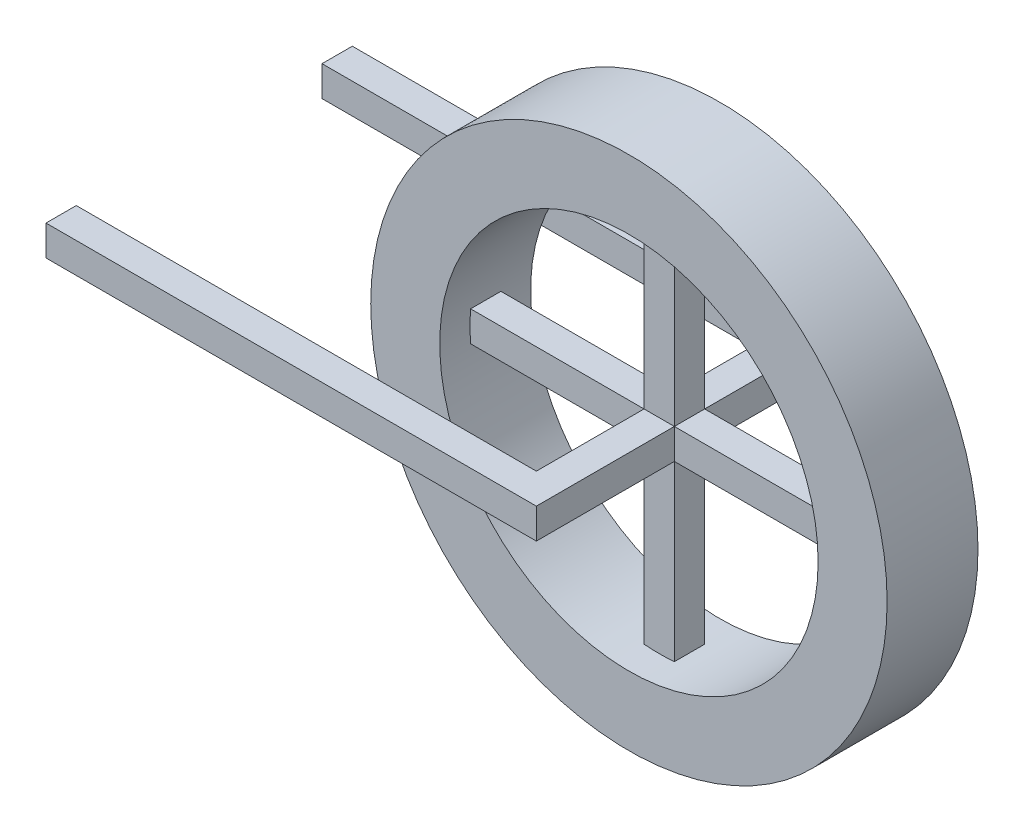
ISO-10303-21;
HEADER;
FILE_DESCRIPTION(('STEP AP214'),'2;1');
FILE_NAME('part.step','',(''),(''),'','','');
FILE_SCHEMA(('AUTOMOTIVE_DESIGN { 1 0 10303 214 1 1 1 1 }'));
ENDSEC;
DATA;
#1=APPLICATION_CONTEXT('core data for automotive mechanical design processes');
#2=APPLICATION_PROTOCOL_DEFINITION('international standard','automotive_design',2000,#1);
#3=PRODUCT_CONTEXT('',#1,'mechanical');
#4=PRODUCT('Part','Part','',(#3));
#5=PRODUCT_RELATED_PRODUCT_CATEGORY('part','',(#4));
#6=PRODUCT_DEFINITION_FORMATION('','',#4);
#7=PRODUCT_DEFINITION_CONTEXT('part definition',#1,'design');
#8=PRODUCT_DEFINITION('design','',#6,#7);
#9=PRODUCT_DEFINITION_SHAPE('','',#8);
#10=(LENGTH_UNIT() NAMED_UNIT(*) SI_UNIT(.MILLI.,.METRE.));
#11=(NAMED_UNIT(*) PLANE_ANGLE_UNIT() SI_UNIT($,.RADIAN.));
#12=(NAMED_UNIT(*) SI_UNIT($,.STERADIAN.) SOLID_ANGLE_UNIT());
#13=UNCERTAINTY_MEASURE_WITH_UNIT(LENGTH_MEASURE(1.E-05),#10,'distance_accuracy_value','');
#14=(GEOMETRIC_REPRESENTATION_CONTEXT(3) GLOBAL_UNCERTAINTY_ASSIGNED_CONTEXT((#13)) GLOBAL_UNIT_ASSIGNED_CONTEXT((#10,
#11,#12)) REPRESENTATION_CONTEXT('',''));
#15=CARTESIAN_POINT('',(0.,0.,0.));
#16=DIRECTION('',(0.,0.,1.));
#17=DIRECTION('',(1.,0.,0.));
#18=AXIS2_PLACEMENT_3D('',#15,#16,#17);
#19=CARTESIAN_POINT('',(56.126,3.29166666666667,13.1666666666667));
#20=DIRECTION('',(0.,0.,-1.));
#21=DIRECTION('',(-1.,0.,0.));
#22=AXIS2_PLACEMENT_3D('',#19,#20,#21);
#23=PLANE('',#22);
#24=DIRECTION('',(-1.,0.,0.));
#25=VECTOR('',#24,1.);
#26=CARTESIAN_POINT('',(56.126,3.29166666666667,13.1666666666667));
#27=LINE('',#26,#25);
#28=CARTESIAN_POINT('',(40.9930549673424,3.29166666666667,13.1666666666667));
#29=VERTEX_POINT('',#28);
#30=CARTESIAN_POINT('',(3.29166666666668,3.29166666666667,13.1666666666667));
#31=VERTEX_POINT('',#30);
#32=EDGE_CURVE('E349',#29,#31,#27,.T.);
#33=ORIENTED_EDGE('',*,*,#32,.T.);
#34=DIRECTION('',(0.,-1.,0.));
#35=VECTOR('',#34,1.);
#36=CARTESIAN_POINT('',(3.29166666666668,3.29166666666667,13.1666666666667));
#37=LINE('',#36,#35);
#38=CARTESIAN_POINT('',(3.29166666666668,-3.29166666666667,13.1666666666667));
#39=VERTEX_POINT('',#38);
#40=EDGE_CURVE('E210',#31,#39,#37,.T.);
#41=ORIENTED_EDGE('',*,*,#40,.T.);
#42=DIRECTION('',(-1.,0.,0.));
#43=VECTOR('',#42,1.);
#44=CARTESIAN_POINT('',(56.126,-3.29166666666667,13.1666666666667));
#45=LINE('',#44,#43);
#46=CARTESIAN_POINT('',(40.9930549673424,-3.29166666666667,13.1666666666667));
#47=VERTEX_POINT('',#46);
#48=EDGE_CURVE('E360',#47,#39,#45,.T.);
#49=ORIENTED_EDGE('',*,*,#48,.F.);
#50=CARTESIAN_POINT('',(0.,0.,13.1666666666667));
#51=DIRECTION('',(0.,0.,-1.));
#52=DIRECTION('',(-1.,0.,0.));
#53=AXIS2_PLACEMENT_3D('',#50,#51,#52);
#54=CIRCLE('',#53,41.125);
#55=EDGE_CURVE('E346',#47,#29,#54,.F.);
#56=ORIENTED_EDGE('',*,*,#55,.T.);
#57=EDGE_LOOP('',(#33,#41,#49,#56));
#58=FACE_BOUND('',#57,.T.);
#59=ADVANCED_FACE('F39',(#58),#23,.F.);
#60=DIRECTION('',(0.,1.,0.));
#61=VECTOR('',#60,1.);
#62=CARTESIAN_POINT('',(-3.29166666666686,-56.1260000000002,13.1666666666667));
#63=LINE('',#62,#61);
#64=CARTESIAN_POINT('',(-3.29166666666668,3.29166666666667,13.1666666666667));
#65=VERTEX_POINT('',#64);
#66=CARTESIAN_POINT('',(-3.29166666666653,40.9930549673424,13.1666666666667));
#67=VERTEX_POINT('',#66);
#68=EDGE_CURVE('E310',#65,#67,#63,.T.);
#69=ORIENTED_EDGE('',*,*,#68,.F.);
#70=DIRECTION('',(1.,0.,0.));
#71=VECTOR('',#70,1.);
#72=CARTESIAN_POINT('',(3.29166666666668,3.29166666666667,13.1666666666667));
#73=LINE('',#72,#71);
#74=EDGE_CURVE('E217',#65,#31,#73,.T.);
#75=ORIENTED_EDGE('',*,*,#74,.T.);
#76=DIRECTION('',(0.,1.,0.));
#77=VECTOR('',#76,1.);
#78=CARTESIAN_POINT('',(3.29166666666647,-56.1260000000002,13.1666666666667));
#79=LINE('',#78,#77);
#80=CARTESIAN_POINT('',(3.29166666666681,40.9930549673424,13.1666666666667));
#81=VERTEX_POINT('',#80);
#82=EDGE_CURVE('E289',#31,#81,#79,.T.);
#83=ORIENTED_EDGE('',*,*,#82,.T.);
#84=CARTESIAN_POINT('',(0.,0.,13.1666666666667));
#85=DIRECTION('',(0.,0.,1.));
#86=DIRECTION('',(1.,0.,0.));
#87=AXIS2_PLACEMENT_3D('',#84,#85,#86);
#88=CIRCLE('',#87,41.125);
#89=EDGE_CURVE('E283',#67,#81,#88,.F.);
#90=ORIENTED_EDGE('',*,*,#89,.F.);
#91=EDGE_LOOP('',(#69,#75,#83,#90));
#92=FACE_BOUND('',#91,.T.);
#93=ADVANCED_FACE('F395',(#92),#23,.F.);
#94=CARTESIAN_POINT('',(-3.29166666666668,-3.29166666666667,13.1666666666667));
#95=VERTEX_POINT('',#94);
#96=CARTESIAN_POINT('',(-40.9930549673424,-3.29166666666667,13.1666666666667));
#97=VERTEX_POINT('',#96);
#98=EDGE_CURVE('E359',#95,#97,#45,.T.);
#99=ORIENTED_EDGE('',*,*,#98,.F.);
#100=DIRECTION('',(0.,1.,0.));
#101=VECTOR('',#100,1.);
#102=CARTESIAN_POINT('',(-3.29166666666668,3.29166666666667,13.1666666666667));
#103=LINE('',#102,#101);
#104=EDGE_CURVE('E220',#95,#65,#103,.T.);
#105=ORIENTED_EDGE('',*,*,#104,.T.);
#106=CARTESIAN_POINT('',(-40.9930549673424,3.29166666666667,13.1666666666667));
#107=VERTEX_POINT('',#106);
#108=EDGE_CURVE('E339',#65,#107,#27,.T.);
#109=ORIENTED_EDGE('',*,*,#108,.T.);
#110=CARTESIAN_POINT('',(0.,0.,13.1666666666667));
#111=DIRECTION('',(0.,0.,1.));
#112=DIRECTION('',(1.,0.,0.));
#113=AXIS2_PLACEMENT_3D('',#110,#111,#112);
#114=CIRCLE('',#113,41.125);
#115=EDGE_CURVE('E333',#97,#107,#114,.F.);
#116=ORIENTED_EDGE('',*,*,#115,.F.);
#117=EDGE_LOOP('',(#99,#105,#109,#116));
#118=FACE_BOUND('',#117,.T.);
#119=ADVANCED_FACE('F473',(#118),#23,.F.);
#120=CARTESIAN_POINT('',(-3.29166666666668,3.29166666666667,-23.4166666666667));
#121=DIRECTION('',(1.,0.,0.));
#122=DIRECTION('',(0.,0.,-1.));
#123=AXIS2_PLACEMENT_3D('',#120,#121,#122);
#124=PLANE('',#123);
#125=DIRECTION('',(0.,1.,0.));
#126=VECTOR('',#125,1.);
#127=CARTESIAN_POINT('',(-3.29166666666668,3.29166666666667,-16.8333333333333));
#128=LINE('',#127,#126);
#129=CARTESIAN_POINT('',(-3.29166666666668,-3.29166666666667,-16.8333333333333));
#130=VERTEX_POINT('',#129);
#131=CARTESIAN_POINT('',(-3.29166666666668,3.29166666666667,-16.8333333333333));
#132=VERTEX_POINT('',#131);
#133=EDGE_CURVE('E231',#130,#132,#128,.T.);
#134=ORIENTED_EDGE('',*,*,#133,.F.);
#135=DIRECTION('',(0.,0.,1.));
#136=VECTOR('',#135,1.);
#137=CARTESIAN_POINT('',(-3.29166666666668,-3.29166666666667,-23.4166666666667));
#138=LINE('',#137,#136);
#139=CARTESIAN_POINT('',(-3.29166666666668,-3.29166666666667,6.58333333333333));
#140=VERTEX_POINT('',#139);
#141=EDGE_CURVE('E272',#130,#140,#138,.T.);
#142=ORIENTED_EDGE('',*,*,#141,.T.);
#143=DIRECTION('',(0.,1.,0.));
#144=VECTOR('',#143,1.);
#145=CARTESIAN_POINT('',(-3.29166666666668,3.29166666666667,6.58333333333333));
#146=LINE('',#145,#144);
#147=CARTESIAN_POINT('',(-3.29166666666665,3.29166666666667,6.58333333333333));
#148=VERTEX_POINT('',#147);
#149=EDGE_CURVE('E263',#140,#148,#146,.T.);
#150=ORIENTED_EDGE('',*,*,#149,.T.);
#151=DIRECTION('',(0.,0.,1.));
#152=VECTOR('',#151,1.);
#153=CARTESIAN_POINT('',(-3.29166666666668,3.29166666666667,-23.4166666666667));
#154=LINE('',#153,#152);
#155=EDGE_CURVE('E270',#132,#148,#154,.T.);
#156=ORIENTED_EDGE('',*,*,#155,.F.);
#157=EDGE_LOOP('',(#134,#142,#150,#156));
#158=FACE_BOUND('',#157,.T.);
#159=ADVANCED_FACE('F438',(#158),#124,.F.);
#160=CARTESIAN_POINT('',(56.126,3.29166666666667,6.58333333333333));
#161=DIRECTION('',(0.,0.,1.));
#162=DIRECTION('',(1.,0.,0.));
#163=AXIS2_PLACEMENT_3D('',#160,#161,#162);
#164=PLANE('',#163);
#165=DIRECTION('',(0.,-1.,0.));
#166=VECTOR('',#165,1.);
#167=CARTESIAN_POINT('',(3.29166666666668,3.29166666666667,6.58333333333333));
#168=LINE('',#167,#166);
#169=CARTESIAN_POINT('',(3.29166666666668,3.29166666666667,6.58333333333333));
#170=VERTEX_POINT('',#169);
#171=CARTESIAN_POINT('',(3.2916666666668,-3.29166666666667,6.58333333333333));
#172=VERTEX_POINT('',#171);
#173=EDGE_CURVE('E248',#170,#172,#168,.T.);
#174=ORIENTED_EDGE('',*,*,#173,.F.);
#175=DIRECTION('',(-1.,0.,0.));
#176=VECTOR('',#175,1.);
#177=CARTESIAN_POINT('',(56.126,3.29166666666667,6.58333333333333));
#178=LINE('',#177,#176);
#179=CARTESIAN_POINT('',(40.9930549673424,3.29166666666667,6.58333333333333));
#180=VERTEX_POINT('',#179);
#181=EDGE_CURVE('E353',#180,#170,#178,.T.);
#182=ORIENTED_EDGE('',*,*,#181,.F.);
#183=CARTESIAN_POINT('',(0.,0.,6.58333333333333));
#184=DIRECTION('',(0.,0.,1.));
#185=DIRECTION('',(1.,0.,0.));
#186=AXIS2_PLACEMENT_3D('',#183,#184,#185);
#187=CIRCLE('',#186,41.125);
#188=CARTESIAN_POINT('',(40.9930549673424,-3.29166666666667,6.58333333333333));
#189=VERTEX_POINT('',#188);
#190=EDGE_CURVE('E340',#180,#189,#187,.F.);
#191=ORIENTED_EDGE('',*,*,#190,.T.);
#192=DIRECTION('',(-1.,0.,0.));
#193=VECTOR('',#192,1.);
#194=CARTESIAN_POINT('',(56.126,-3.29166666666667,6.58333333333333));
#195=LINE('',#194,#193);
#196=EDGE_CURVE('E356',#189,#172,#195,.T.);
#197=ORIENTED_EDGE('',*,*,#196,.T.);
#198=EDGE_LOOP('',(#174,#182,#191,#197));
#199=FACE_BOUND('',#198,.T.);
#200=ADVANCED_FACE('F412',(#199),#164,.F.);
#201=DIRECTION('',(-1.,0.,0.));
#202=VECTOR('',#201,1.);
#203=CARTESIAN_POINT('',(3.29166666666668,-3.29166666666667,6.58333333333333));
#204=LINE('',#203,#202);
#205=EDGE_CURVE('E260',#172,#140,#204,.T.);
#206=ORIENTED_EDGE('',*,*,#205,.F.);
#207=DIRECTION('',(0.,1.,0.));
#208=VECTOR('',#207,1.);
#209=CARTESIAN_POINT('',(3.29166666666647,-56.1260000000002,6.58333333333333));
#210=LINE('',#209,#208);
#211=CARTESIAN_POINT('',(3.29166666666652,-40.9930549673424,6.58333333333333));
#212=VERTEX_POINT('',#211);
#213=EDGE_CURVE('E303',#212,#172,#210,.T.);
#214=ORIENTED_EDGE('',*,*,#213,.F.);
#215=CARTESIAN_POINT('',(0.,0.,6.58333333333333));
#216=DIRECTION('',(0.,0.,1.));
#217=DIRECTION('',(1.,0.,0.));
#218=AXIS2_PLACEMENT_3D('',#215,#216,#217);
#219=CIRCLE('',#218,41.125);
#220=CARTESIAN_POINT('',(-3.29166666666681,-40.9930549673424,6.58333333333333));
#221=VERTEX_POINT('',#220);
#222=EDGE_CURVE('E290',#212,#221,#219,.F.);
#223=ORIENTED_EDGE('',*,*,#222,.T.);
#224=DIRECTION('',(0.,1.,0.));
#225=VECTOR('',#224,1.);
#226=CARTESIAN_POINT('',(-3.29166666666686,-56.1260000000002,6.58333333333333));
#227=LINE('',#226,#225);
#228=EDGE_CURVE('E307',#221,#140,#227,.T.);
#229=ORIENTED_EDGE('',*,*,#228,.T.);
#230=EDGE_LOOP('',(#206,#214,#223,#229));
#231=FACE_BOUND('',#230,.T.);
#232=ADVANCED_FACE('F454',(#231),#164,.F.);
#233=ORIENTED_EDGE('',*,*,#149,.F.);
#234=CARTESIAN_POINT('',(-40.9930549673424,-3.29166666666667,6.58333333333333));
#235=VERTEX_POINT('',#234);
#236=EDGE_CURVE('E355',#140,#235,#195,.T.);
#237=ORIENTED_EDGE('',*,*,#236,.T.);
#238=CARTESIAN_POINT('',(0.,0.,6.58333333333333));
#239=DIRECTION('',(0.,0.,-1.));
#240=DIRECTION('',(-1.,0.,0.));
#241=AXIS2_PLACEMENT_3D('',#238,#239,#240);
#242=CIRCLE('',#241,41.125);
#243=CARTESIAN_POINT('',(-40.9930549673424,3.29166666666667,6.58333333333333));
#244=VERTEX_POINT('',#243);
#245=EDGE_CURVE('E327',#244,#235,#242,.F.);
#246=ORIENTED_EDGE('',*,*,#245,.F.);
#247=EDGE_CURVE('E352',#148,#244,#178,.T.);
#248=ORIENTED_EDGE('',*,*,#247,.F.);
#249=EDGE_LOOP('',(#233,#237,#246,#248));
#250=FACE_BOUND('',#249,.T.);
#251=ADVANCED_FACE('F444',(#250),#164,.F.);
#252=DIRECTION('',(1.,0.,0.));
#253=VECTOR('',#252,1.);
#254=CARTESIAN_POINT('',(3.29166666666668,3.29166666666667,6.58333333333333));
#255=LINE('',#254,#253);
#256=EDGE_CURVE('E253',#148,#170,#255,.T.);
#257=ORIENTED_EDGE('',*,*,#256,.F.);
#258=CARTESIAN_POINT('',(-3.29166666666652,40.9930549673424,6.58333333333333));
#259=VERTEX_POINT('',#258);
#260=EDGE_CURVE('E306',#148,#259,#227,.T.);
#261=ORIENTED_EDGE('',*,*,#260,.T.);
#262=CARTESIAN_POINT('',(0.,0.,6.58333333333333));
#263=DIRECTION('',(0.,0.,-1.));
#264=DIRECTION('',(-1.,0.,0.));
#265=AXIS2_PLACEMENT_3D('',#262,#263,#264);
#266=CIRCLE('',#265,41.125);
#267=CARTESIAN_POINT('',(3.29166666666681,40.9930549673424,6.58333333333333));
#268=VERTEX_POINT('',#267);
#269=EDGE_CURVE('E277',#268,#259,#266,.F.);
#270=ORIENTED_EDGE('',*,*,#269,.F.);
#271=EDGE_CURVE('E302',#170,#268,#210,.T.);
#272=ORIENTED_EDGE('',*,*,#271,.F.);
#273=EDGE_LOOP('',(#257,#261,#270,#272));
#274=FACE_BOUND('',#273,.T.);
#275=ADVANCED_FACE('F377',(#274),#164,.F.);
#276=CARTESIAN_POINT('',(0.,0.,19.75));
#277=DIRECTION('',(0.,0.,-1.));
#278=DIRECTION('',(-1.,0.,0.));
#279=AXIS2_PLACEMENT_3D('',#276,#277,#278);
#280=CYLINDRICAL_SURFACE('',#279,41.125);
#281=CARTESIAN_POINT('',(0.,0.,19.75));
#282=DIRECTION('',(0.,0.,1.));
#283=DIRECTION('',(1.,0.,0.));
#284=AXIS2_PLACEMENT_3D('',#281,#282,#283);
#285=CIRCLE('',#284,41.125);
#286=CARTESIAN_POINT('',(41.125,0.,19.75));
#287=VERTEX_POINT('',#286);
#288=EDGE_CURVE('E365',#287,#287,#285,.T.);
#289=ORIENTED_EDGE('',*,*,#288,.T.);
#290=EDGE_LOOP('',(#289));
#291=FACE_BOUND('',#290,.T.);
#292=CARTESIAN_POINT('',(0.,0.,0.));
#293=DIRECTION('',(0.,0.,1.));
#294=DIRECTION('',(1.,0.,0.));
#295=AXIS2_PLACEMENT_3D('',#292,#293,#294);
#296=CIRCLE('',#295,41.125);
#297=CARTESIAN_POINT('',(41.125,0.,0.));
#298=VERTEX_POINT('',#297);
#299=EDGE_CURVE('E348',#298,#298,#296,.T.);
#300=ORIENTED_EDGE('',*,*,#299,.F.);
#301=EDGE_LOOP('',(#300));
#302=FACE_BOUND('',#301,.T.);
#303=ORIENTED_EDGE('',*,*,#115,.T.);
#304=DIRECTION('',(0.,0.,-1.));
#305=VECTOR('',#304,1.);
#306=CARTESIAN_POINT('',(-40.9930549673424,3.29166666666667,19.75));
#307=LINE('',#306,#305);
#308=EDGE_CURVE('E330',#107,#244,#307,.T.);
#309=ORIENTED_EDGE('',*,*,#308,.T.);
#310=ORIENTED_EDGE('',*,*,#245,.T.);
#311=DIRECTION('',(0.,0.,-1.));
#312=VECTOR('',#311,1.);
#313=CARTESIAN_POINT('',(-40.9930549673424,-3.29166666666667,19.75));
#314=LINE('',#313,#312);
#315=EDGE_CURVE('E336',#235,#97,#314,.F.);
#316=ORIENTED_EDGE('',*,*,#315,.T.);
#317=EDGE_LOOP('',(#303,#309,#310,#316));
#318=FACE_BOUND('',#317,.T.);
#319=ORIENTED_EDGE('',*,*,#190,.F.);
#320=DIRECTION('',(0.,0.,-1.));
#321=VECTOR('',#320,1.);
#322=CARTESIAN_POINT('',(40.9930549673424,3.29166666666667,19.75));
#323=LINE('',#322,#321);
#324=EDGE_CURVE('E344',#29,#180,#323,.T.);
#325=ORIENTED_EDGE('',*,*,#324,.F.);
#326=ORIENTED_EDGE('',*,*,#55,.F.);
#327=DIRECTION('',(0.,0.,-1.));
#328=VECTOR('',#327,1.);
#329=CARTESIAN_POINT('',(40.9930549673424,-3.29166666666667,19.75));
#330=LINE('',#329,#328);
#331=EDGE_CURVE('E343',#189,#47,#330,.F.);
#332=ORIENTED_EDGE('',*,*,#331,.F.);
#333=EDGE_LOOP('',(#319,#325,#326,#332));
#334=FACE_BOUND('',#333,.T.);
#335=ORIENTED_EDGE('',*,*,#222,.F.);
#336=DIRECTION('',(0.,0.,-1.));
#337=VECTOR('',#336,1.);
#338=CARTESIAN_POINT('',(3.29166666666652,-40.9930549673424,19.75));
#339=LINE('',#338,#337);
#340=CARTESIAN_POINT('',(3.29166666666652,-40.9930549673424,13.1666666666667));
#341=VERTEX_POINT('',#340);
#342=EDGE_CURVE('E294',#341,#212,#339,.T.);
#343=ORIENTED_EDGE('',*,*,#342,.F.);
#344=CARTESIAN_POINT('',(0.,0.,13.1666666666667));
#345=DIRECTION('',(0.,0.,-1.));
#346=DIRECTION('',(-1.,0.,0.));
#347=AXIS2_PLACEMENT_3D('',#344,#345,#346);
#348=CIRCLE('',#347,41.125);
#349=CARTESIAN_POINT('',(-3.29166666666681,-40.9930549673424,13.1666666666667));
#350=VERTEX_POINT('',#349);
#351=EDGE_CURVE('E296',#350,#341,#348,.F.);
#352=ORIENTED_EDGE('',*,*,#351,.F.);
#353=DIRECTION('',(0.,0.,-1.));
#354=VECTOR('',#353,1.);
#355=CARTESIAN_POINT('',(-3.29166666666681,-40.9930549673424,19.75));
#356=LINE('',#355,#354);
#357=EDGE_CURVE('E293',#221,#350,#356,.F.);
#358=ORIENTED_EDGE('',*,*,#357,.F.);
#359=EDGE_LOOP('',(#335,#343,#352,#358));
#360=FACE_BOUND('',#359,.T.);
#361=ORIENTED_EDGE('',*,*,#89,.T.);
#362=DIRECTION('',(0.,0.,-1.));
#363=VECTOR('',#362,1.);
#364=CARTESIAN_POINT('',(3.29166666666681,40.9930549673424,19.75));
#365=LINE('',#364,#363);
#366=EDGE_CURVE('E280',#81,#268,#365,.T.);
#367=ORIENTED_EDGE('',*,*,#366,.T.);
#368=ORIENTED_EDGE('',*,*,#269,.T.);
#369=DIRECTION('',(0.,0.,-1.));
#370=VECTOR('',#369,1.);
#371=CARTESIAN_POINT('',(-3.29166666666653,40.9930549673424,19.75));
#372=LINE('',#371,#370);
#373=EDGE_CURVE('E286',#259,#67,#372,.F.);
#374=ORIENTED_EDGE('',*,*,#373,.T.);
#375=EDGE_LOOP('',(#361,#367,#368,#374));
#376=FACE_BOUND('',#375,.T.);
#377=ADVANCED_FACE('F373',(#291,#302,#318,#334,#360,#376),#280,.F.);
#378=CARTESIAN_POINT('',(56.126,3.29166666666667,13.1666666666667));
#379=DIRECTION('',(0.,-1.,0.));
#380=DIRECTION('',(0.,0.,-1.));
#381=AXIS2_PLACEMENT_3D('',#378,#379,#380);
#382=PLANE('',#381);
#383=DIRECTION('',(0.,0.,-1.));
#384=VECTOR('',#383,1.);
#385=CARTESIAN_POINT('',(3.29166666666668,3.29166666666667,13.1666666666667));
#386=LINE('',#385,#384);
#387=EDGE_CURVE('E324',#31,#170,#386,.T.);
#388=ORIENTED_EDGE('',*,*,#387,.F.);
#389=ORIENTED_EDGE('',*,*,#32,.F.);
#390=ORIENTED_EDGE('',*,*,#324,.T.);
#391=ORIENTED_EDGE('',*,*,#181,.T.);
#392=EDGE_LOOP('',(#388,#389,#390,#391));
#393=FACE_BOUND('',#392,.T.);
#394=ADVANCED_FACE('F376',(#393),#382,.F.);
#395=DIRECTION('',(0.,0.,1.));
#396=VECTOR('',#395,1.);
#397=CARTESIAN_POINT('',(-3.29166666666666,3.29166666666667,13.1666666666666));
#398=LINE('',#397,#396);
#399=EDGE_CURVE('E318',#148,#65,#398,.T.);
#400=ORIENTED_EDGE('',*,*,#399,.F.);
#401=ORIENTED_EDGE('',*,*,#247,.T.);
#402=ORIENTED_EDGE('',*,*,#308,.F.);
#403=ORIENTED_EDGE('',*,*,#108,.F.);
#404=EDGE_LOOP('',(#400,#401,#402,#403));
#405=FACE_BOUND('',#404,.T.);
#406=ADVANCED_FACE('F494',(#405),#382,.F.);
#407=CARTESIAN_POINT('',(56.126,-3.29166666666667,13.1666666666667));
#408=DIRECTION('',(0.,1.,0.));
#409=DIRECTION('',(0.,0.,1.));
#410=AXIS2_PLACEMENT_3D('',#407,#408,#409);
#411=PLANE('',#410);
#412=DIRECTION('',(0.,0.,1.));
#413=VECTOR('',#412,1.);
#414=CARTESIAN_POINT('',(3.29166666666666,-3.29166666666667,13.1666666666667));
#415=LINE('',#414,#413);
#416=EDGE_CURVE('E321',#172,#39,#415,.T.);
#417=ORIENTED_EDGE('',*,*,#416,.F.);
#418=ORIENTED_EDGE('',*,*,#196,.F.);
#419=ORIENTED_EDGE('',*,*,#331,.T.);
#420=ORIENTED_EDGE('',*,*,#48,.T.);
#421=EDGE_LOOP('',(#417,#418,#419,#420));
#422=FACE_BOUND('',#421,.T.);
#423=ADVANCED_FACE('F410',(#422),#411,.F.);
#424=DIRECTION('',(0.,0.,-1.));
#425=VECTOR('',#424,1.);
#426=CARTESIAN_POINT('',(-3.29166666666668,-3.29166666666667,13.1666666666666));
#427=LINE('',#426,#425);
#428=EDGE_CURVE('E298',#95,#140,#427,.T.);
#429=ORIENTED_EDGE('',*,*,#428,.F.);
#430=ORIENTED_EDGE('',*,*,#98,.T.);
#431=ORIENTED_EDGE('',*,*,#315,.F.);
#432=ORIENTED_EDGE('',*,*,#236,.F.);
#433=EDGE_LOOP('',(#429,#430,#431,#432));
#434=FACE_BOUND('',#433,.T.);
#435=ADVANCED_FACE('F449',(#434),#411,.F.);
#436=CARTESIAN_POINT('',(0.,0.,19.75));
#437=DIRECTION('',(0.,0.,1.));
#438=DIRECTION('',(1.,0.,0.));
#439=AXIS2_PLACEMENT_3D('',#436,#437,#438);
#440=PLANE('',#439);
#441=CARTESIAN_POINT('',(0.,0.,19.75));
#442=DIRECTION('',(0.,0.,1.));
#443=DIRECTION('',(1.,0.,0.));
#444=AXIS2_PLACEMENT_3D('',#441,#442,#443);
#445=CIRCLE('',#444,56.125);
#446=CARTESIAN_POINT('',(56.125,0.,19.75));
#447=VERTEX_POINT('',#446);
#448=EDGE_CURVE('E11',#447,#447,#445,.T.);
#449=ORIENTED_EDGE('',*,*,#448,.T.);
#450=EDGE_LOOP('',(#449));
#451=FACE_BOUND('',#450,.T.);
#452=ORIENTED_EDGE('',*,*,#288,.F.);
#453=EDGE_LOOP('',(#452));
#454=FACE_BOUND('',#453,.T.);
#455=ADVANCED_FACE('F621',(#451,#454),#440,.T.);
#456=CARTESIAN_POINT('',(0.,0.,0.));
#457=DIRECTION('',(0.,0.,1.));
#458=DIRECTION('',(1.,0.,0.));
#459=AXIS2_PLACEMENT_3D('',#456,#457,#458);
#460=PLANE('',#459);
#461=CARTESIAN_POINT('',(0.,0.,0.));
#462=DIRECTION('',(0.,0.,1.));
#463=DIRECTION('',(1.,0.,0.));
#464=AXIS2_PLACEMENT_3D('',#461,#462,#463);
#465=CIRCLE('',#464,56.125);
#466=CARTESIAN_POINT('',(56.125,0.,0.));
#467=VERTEX_POINT('',#466);
#468=EDGE_CURVE('E43',#467,#467,#465,.T.);
#469=ORIENTED_EDGE('',*,*,#468,.F.);
#470=EDGE_LOOP('',(#469));
#471=FACE_BOUND('',#470,.T.);
#472=ORIENTED_EDGE('',*,*,#299,.T.);
#473=EDGE_LOOP('',(#472));
#474=FACE_BOUND('',#473,.T.);
#475=ADVANCED_FACE('F371',(#471,#474),#460,.F.);
#476=CARTESIAN_POINT('',(0.,0.,19.75));
#477=DIRECTION('',(0.,0.,-1.));
#478=DIRECTION('',(-1.,0.,0.));
#479=AXIS2_PLACEMENT_3D('',#476,#477,#478);
#480=CYLINDRICAL_SURFACE('',#479,56.125);
#481=ORIENTED_EDGE('',*,*,#448,.F.);
#482=EDGE_LOOP('',(#481));
#483=FACE_BOUND('',#482,.T.);
#484=ORIENTED_EDGE('',*,*,#468,.T.);
#485=EDGE_LOOP('',(#484));
#486=FACE_BOUND('',#485,.T.);
#487=ADVANCED_FACE('F41',(#483,#486),#480,.T.);
#488=EDGE_CURVE('E299',#341,#39,#79,.T.);
#489=ORIENTED_EDGE('',*,*,#488,.T.);
#490=DIRECTION('',(-1.,0.,0.));
#491=VECTOR('',#490,1.);
#492=CARTESIAN_POINT('',(3.29166666666668,-3.29166666666667,13.1666666666667));
#493=LINE('',#492,#491);
#494=EDGE_CURVE('E211',#39,#95,#493,.T.);
#495=ORIENTED_EDGE('',*,*,#494,.T.);
#496=EDGE_CURVE('E311',#350,#95,#63,.T.);
#497=ORIENTED_EDGE('',*,*,#496,.F.);
#498=ORIENTED_EDGE('',*,*,#351,.T.);
#499=EDGE_LOOP('',(#489,#495,#497,#498));
#500=FACE_BOUND('',#499,.T.);
#501=ADVANCED_FACE('F469',(#500),#23,.F.);
#502=CARTESIAN_POINT('',(-3.29166666666686,-56.1260000000002,13.1666666666667));
#503=DIRECTION('',(1.,0.,0.));
#504=DIRECTION('',(0.,1.,0.));
#505=AXIS2_PLACEMENT_3D('',#502,#503,#504);
#506=PLANE('',#505);
#507=ORIENTED_EDGE('',*,*,#496,.T.);
#508=ORIENTED_EDGE('',*,*,#428,.T.);
#509=ORIENTED_EDGE('',*,*,#228,.F.);
#510=ORIENTED_EDGE('',*,*,#357,.T.);
#511=EDGE_LOOP('',(#507,#508,#509,#510));
#512=FACE_BOUND('',#511,.T.);
#513=ADVANCED_FACE('F451',(#512),#506,.F.);
#514=CARTESIAN_POINT('',(3.29166666666647,-56.1260000000002,13.1666666666667));
#515=DIRECTION('',(-1.,0.,0.));
#516=DIRECTION('',(0.,-1.,0.));
#517=AXIS2_PLACEMENT_3D('',#514,#515,#516);
#518=PLANE('',#517);
#519=ORIENTED_EDGE('',*,*,#213,.T.);
#520=ORIENTED_EDGE('',*,*,#416,.T.);
#521=ORIENTED_EDGE('',*,*,#488,.F.);
#522=ORIENTED_EDGE('',*,*,#342,.T.);
#523=EDGE_LOOP('',(#519,#520,#521,#522));
#524=FACE_BOUND('',#523,.T.);
#525=ADVANCED_FACE('F481',(#524),#518,.F.);
#526=ORIENTED_EDGE('',*,*,#82,.F.);
#527=ORIENTED_EDGE('',*,*,#387,.T.);
#528=ORIENTED_EDGE('',*,*,#271,.T.);
#529=ORIENTED_EDGE('',*,*,#366,.F.);
#530=EDGE_LOOP('',(#526,#527,#528,#529));
#531=FACE_BOUND('',#530,.T.);
#532=ADVANCED_FACE('F399',(#531),#518,.F.);
#533=ORIENTED_EDGE('',*,*,#260,.F.);
#534=ORIENTED_EDGE('',*,*,#399,.T.);
#535=ORIENTED_EDGE('',*,*,#68,.T.);
#536=ORIENTED_EDGE('',*,*,#373,.F.);
#537=EDGE_LOOP('',(#533,#534,#535,#536));
#538=FACE_BOUND('',#537,.T.);
#539=ADVANCED_FACE('F464',(#538),#506,.F.);
#540=CARTESIAN_POINT('',(3.29166666666668,3.29166666666667,-23.4166666666667));
#541=DIRECTION('',(-1.,0.,0.));
#542=DIRECTION('',(0.,0.,1.));
#543=AXIS2_PLACEMENT_3D('',#540,#541,#542);
#544=PLANE('',#543);
#545=ORIENTED_EDGE('',*,*,#173,.T.);
#546=DIRECTION('',(0.,0.,1.));
#547=VECTOR('',#546,1.);
#548=CARTESIAN_POINT('',(3.29166666666668,-3.29166666666667,-23.4166666666667));
#549=LINE('',#548,#547);
#550=CARTESIAN_POINT('',(3.29166666666668,-3.29166666666667,-23.4166666666667));
#551=VERTEX_POINT('',#550);
#552=EDGE_CURVE('E274',#551,#172,#549,.T.);
#553=ORIENTED_EDGE('',*,*,#552,.F.);
#554=DIRECTION('',(0.,-1.,0.));
#555=VECTOR('',#554,1.);
#556=CARTESIAN_POINT('',(3.29166666666668,3.29166666666667,-23.4166666666667));
#557=LINE('',#556,#555);
#558=CARTESIAN_POINT('',(3.29166666666668,3.29166666666667,-23.4166666666667));
#559=VERTEX_POINT('',#558);
#560=EDGE_CURVE('E249',#559,#551,#557,.T.);
#561=ORIENTED_EDGE('',*,*,#560,.F.);
#562=DIRECTION('',(0.,0.,1.));
#563=VECTOR('',#562,1.);
#564=CARTESIAN_POINT('',(3.29166666666668,3.29166666666667,-23.4166666666667));
#565=LINE('',#564,#563);
#566=EDGE_CURVE('E257',#559,#170,#565,.T.);
#567=ORIENTED_EDGE('',*,*,#566,.T.);
#568=EDGE_LOOP('',(#545,#553,#561,#567));
#569=FACE_BOUND('',#568,.T.);
#570=ADVANCED_FACE('F423',(#569),#544,.F.);
#571=CARTESIAN_POINT('',(3.29166666666668,-3.29166666666667,-23.4166666666667));
#572=DIRECTION('',(0.,1.,0.));
#573=DIRECTION('',(0.,0.,1.));
#574=AXIS2_PLACEMENT_3D('',#571,#572,#573);
#575=PLANE('',#574);
#576=ORIENTED_EDGE('',*,*,#205,.T.);
#577=ORIENTED_EDGE('',*,*,#141,.F.);
#578=DIRECTION('',(1.,0.,0.));
#579=VECTOR('',#578,1.);
#580=CARTESIAN_POINT('',(-103.291666666667,-3.29166666666667,-16.8333333333333));
#581=LINE('',#580,#579);
#582=CARTESIAN_POINT('',(-103.291666666667,-3.29166666666667,-16.8333333333333));
#583=VERTEX_POINT('',#582);
#584=EDGE_CURVE('E246',#583,#130,#581,.T.);
#585=ORIENTED_EDGE('',*,*,#584,.F.);
#586=DIRECTION('',(0.,0.,1.));
#587=VECTOR('',#586,1.);
#588=CARTESIAN_POINT('',(-103.291666666667,-3.29166666666667,-23.4166666666667));
#589=LINE('',#588,#587);
#590=CARTESIAN_POINT('',(-103.291666666667,-3.29166666666667,-23.4166666666667));
#591=VERTEX_POINT('',#590);
#592=EDGE_CURVE('E235',#591,#583,#589,.T.);
#593=ORIENTED_EDGE('',*,*,#592,.F.);
#594=DIRECTION('',(-1.,0.,0.));
#595=VECTOR('',#594,1.);
#596=CARTESIAN_POINT('',(3.29166666666668,-3.29166666666667,-23.4166666666667));
#597=LINE('',#596,#595);
#598=EDGE_CURVE('E252',#551,#591,#597,.T.);
#599=ORIENTED_EDGE('',*,*,#598,.F.);
#600=ORIENTED_EDGE('',*,*,#552,.T.);
#601=EDGE_LOOP('',(#576,#577,#585,#593,#599,#600));
#602=FACE_BOUND('',#601,.T.);
#603=ADVANCED_FACE('F456',(#602),#575,.F.);
#604=CARTESIAN_POINT('',(3.29166666666668,3.29166666666667,-23.4166666666667));
#605=DIRECTION('',(0.,-1.,0.));
#606=DIRECTION('',(0.,0.,-1.));
#607=AXIS2_PLACEMENT_3D('',#604,#605,#606);
#608=PLANE('',#607);
#609=ORIENTED_EDGE('',*,*,#256,.T.);
#610=ORIENTED_EDGE('',*,*,#566,.F.);
#611=DIRECTION('',(1.,0.,0.));
#612=VECTOR('',#611,1.);
#613=CARTESIAN_POINT('',(3.29166666666668,3.29166666666667,-23.4166666666667));
#614=LINE('',#613,#612);
#615=CARTESIAN_POINT('',(-103.291666666667,3.29166666666667,-23.4166666666667));
#616=VERTEX_POINT('',#615);
#617=EDGE_CURVE('E255',#616,#559,#614,.T.);
#618=ORIENTED_EDGE('',*,*,#617,.F.);
#619=DIRECTION('',(0.,0.,-1.));
#620=VECTOR('',#619,1.);
#621=CARTESIAN_POINT('',(-103.291666666667,3.29166666666667,-23.4166666666667));
#622=LINE('',#621,#620);
#623=CARTESIAN_POINT('',(-103.291666666667,3.29166666666667,-16.8333333333333));
#624=VERTEX_POINT('',#623);
#625=EDGE_CURVE('E239',#624,#616,#622,.T.);
#626=ORIENTED_EDGE('',*,*,#625,.F.);
#627=DIRECTION('',(1.,0.,0.));
#628=VECTOR('',#627,1.);
#629=CARTESIAN_POINT('',(-103.291666666667,3.29166666666667,-16.8333333333333));
#630=LINE('',#629,#628);
#631=EDGE_CURVE('E242',#624,#132,#630,.T.);
#632=ORIENTED_EDGE('',*,*,#631,.T.);
#633=ORIENTED_EDGE('',*,*,#155,.T.);
#634=EDGE_LOOP('',(#609,#610,#618,#626,#632,#633));
#635=FACE_BOUND('',#634,.T.);
#636=ADVANCED_FACE('F418',(#635),#608,.F.);
#637=CARTESIAN_POINT('',(0.,0.,-23.4166666666667));
#638=DIRECTION('',(0.,0.,-1.));
#639=DIRECTION('',(-1.,0.,0.));
#640=AXIS2_PLACEMENT_3D('',#637,#638,#639);
#641=PLANE('',#640);
#642=ORIENTED_EDGE('',*,*,#560,.T.);
#643=ORIENTED_EDGE('',*,*,#598,.T.);
#644=DIRECTION('',(0.,-1.,0.));
#645=VECTOR('',#644,1.);
#646=CARTESIAN_POINT('',(-103.291666666667,3.29166666666667,-23.4166666666667));
#647=LINE('',#646,#645);
#648=EDGE_CURVE('E232',#616,#591,#647,.T.);
#649=ORIENTED_EDGE('',*,*,#648,.F.);
#650=ORIENTED_EDGE('',*,*,#617,.T.);
#651=EDGE_LOOP('',(#642,#643,#649,#650));
#652=FACE_BOUND('',#651,.T.);
#653=ADVANCED_FACE('F425',(#652),#641,.T.);
#654=CARTESIAN_POINT('',(-103.291666666667,3.29166666666667,-16.8333333333333));
#655=DIRECTION('',(0.,0.,-1.));
#656=DIRECTION('',(-1.,0.,0.));
#657=AXIS2_PLACEMENT_3D('',#654,#655,#656);
#658=PLANE('',#657);
#659=ORIENTED_EDGE('',*,*,#133,.T.);
#660=ORIENTED_EDGE('',*,*,#631,.F.);
#661=DIRECTION('',(0.,1.,0.));
#662=VECTOR('',#661,1.);
#663=CARTESIAN_POINT('',(-103.291666666667,3.29166666666667,-16.8333333333333));
#664=LINE('',#663,#662);
#665=EDGE_CURVE('E237',#583,#624,#664,.T.);
#666=ORIENTED_EDGE('',*,*,#665,.F.);
#667=ORIENTED_EDGE('',*,*,#584,.T.);
#668=EDGE_LOOP('',(#659,#660,#666,#667));
#669=FACE_BOUND('',#668,.T.);
#670=ADVANCED_FACE('F435',(#669),#658,.F.);
#671=CARTESIAN_POINT('',(-103.291666666667,0.,0.));
#672=DIRECTION('',(-1.,0.,0.));
#673=DIRECTION('',(0.,0.,1.));
#674=AXIS2_PLACEMENT_3D('',#671,#672,#673);
#675=PLANE('',#674);
#676=ORIENTED_EDGE('',*,*,#648,.T.);
#677=ORIENTED_EDGE('',*,*,#592,.T.);
#678=ORIENTED_EDGE('',*,*,#665,.T.);
#679=ORIENTED_EDGE('',*,*,#625,.T.);
#680=EDGE_LOOP('',(#676,#677,#678,#679));
#681=FACE_BOUND('',#680,.T.);
#682=ADVANCED_FACE('F430',(#681),#675,.T.);
#683=CARTESIAN_POINT('',(3.29166666666668,3.29166666666667,43.1666666666667));
#684=DIRECTION('',(1.,0.,0.));
#685=DIRECTION('',(0.,0.,-1.));
#686=AXIS2_PLACEMENT_3D('',#683,#684,#685);
#687=PLANE('',#686);
#688=ORIENTED_EDGE('',*,*,#40,.F.);
#689=DIRECTION('',(0.,0.,-1.));
#690=VECTOR('',#689,1.);
#691=CARTESIAN_POINT('',(3.29166666666668,3.29166666666667,43.1666666666667));
#692=LINE('',#691,#690);
#693=CARTESIAN_POINT('',(3.29166666666668,3.29166666666667,43.1666666666667));
#694=VERTEX_POINT('',#693);
#695=EDGE_CURVE('E229',#694,#31,#692,.T.);
#696=ORIENTED_EDGE('',*,*,#695,.F.);
#697=DIRECTION('',(0.,-1.,0.));
#698=VECTOR('',#697,1.);
#699=CARTESIAN_POINT('',(3.29166666666668,3.29166666666667,43.1666666666667));
#700=LINE('',#699,#698);
#701=CARTESIAN_POINT('',(3.29166666666668,-3.29166666666667,43.1666666666667));
#702=VERTEX_POINT('',#701);
#703=EDGE_CURVE('E183',#694,#702,#700,.T.);
#704=ORIENTED_EDGE('',*,*,#703,.T.);
#705=DIRECTION('',(0.,0.,-1.));
#706=VECTOR('',#705,1.);
#707=CARTESIAN_POINT('',(3.29166666666668,-3.29166666666667,43.1666666666667));
#708=LINE('',#707,#706);
#709=EDGE_CURVE('E214',#702,#39,#708,.T.);
#710=ORIENTED_EDGE('',*,*,#709,.T.);
#711=EDGE_LOOP('',(#688,#696,#704,#710));
#712=FACE_BOUND('',#711,.T.);
#713=ADVANCED_FACE('F571',(#712),#687,.T.);
#714=CARTESIAN_POINT('',(3.29166666666668,3.29166666666667,43.1666666666667));
#715=DIRECTION('',(0.,1.,0.));
#716=DIRECTION('',(0.,0.,1.));
#717=AXIS2_PLACEMENT_3D('',#714,#715,#716);
#718=PLANE('',#717);
#719=ORIENTED_EDGE('',*,*,#74,.F.);
#720=DIRECTION('',(0.,0.,-1.));
#721=VECTOR('',#720,1.);
#722=CARTESIAN_POINT('',(-3.29166666666668,3.29166666666667,43.1666666666667));
#723=LINE('',#722,#721);
#724=CARTESIAN_POINT('',(-3.29166666666668,3.29166666666667,36.5833333333333));
#725=VERTEX_POINT('',#724);
#726=EDGE_CURVE('E227',#725,#65,#723,.T.);
#727=ORIENTED_EDGE('',*,*,#726,.F.);
#728=DIRECTION('',(1.,0.,0.));
#729=VECTOR('',#728,1.);
#730=CARTESIAN_POINT('',(-103.291666666667,3.29166666666667,36.5833333333333));
#731=LINE('',#730,#729);
#732=CARTESIAN_POINT('',(-103.291666666667,3.29166666666667,36.5833333333333));
#733=VERTEX_POINT('',#732);
#734=EDGE_CURVE('E200',#733,#725,#731,.T.);
#735=ORIENTED_EDGE('',*,*,#734,.F.);
#736=DIRECTION('',(0.,0.,1.));
#737=VECTOR('',#736,1.);
#738=CARTESIAN_POINT('',(-103.291666666667,3.29166666666667,43.1666666666667));
#739=LINE('',#738,#737);
#740=CARTESIAN_POINT('',(-103.291666666667,3.29166666666667,43.1666666666667));
#741=VERTEX_POINT('',#740);
#742=EDGE_CURVE('E192',#733,#741,#739,.T.);
#743=ORIENTED_EDGE('',*,*,#742,.T.);
#744=DIRECTION('',(1.,0.,0.));
#745=VECTOR('',#744,1.);
#746=CARTESIAN_POINT('',(3.29166666666668,3.29166666666667,43.1666666666667));
#747=LINE('',#746,#745);
#748=EDGE_CURVE('E176',#741,#694,#747,.T.);
#749=ORIENTED_EDGE('',*,*,#748,.T.);
#750=ORIENTED_EDGE('',*,*,#695,.T.);
#751=EDGE_LOOP('',(#719,#727,#735,#743,#749,#750));
#752=FACE_BOUND('',#751,.T.);
#753=ADVANCED_FACE('F198',(#752),#718,.T.);
#754=CARTESIAN_POINT('',(-3.29166666666668,3.29166666666667,43.1666666666667));
#755=DIRECTION('',(-1.,0.,0.));
#756=DIRECTION('',(0.,0.,1.));
#757=AXIS2_PLACEMENT_3D('',#754,#755,#756);
#758=PLANE('',#757);
#759=DIRECTION('',(0.,1.,0.));
#760=VECTOR('',#759,1.);
#761=CARTESIAN_POINT('',(-3.29166666666668,3.29166666666667,36.5833333333333));
#762=LINE('',#761,#760);
#763=CARTESIAN_POINT('',(-3.29166666666668,-3.29166666666667,36.5833333333333));
#764=VERTEX_POINT('',#763);
#765=EDGE_CURVE('E54',#764,#725,#762,.T.);
#766=ORIENTED_EDGE('',*,*,#765,.T.);
#767=ORIENTED_EDGE('',*,*,#726,.T.);
#768=ORIENTED_EDGE('',*,*,#104,.F.);
#769=DIRECTION('',(0.,0.,-1.));
#770=VECTOR('',#769,1.);
#771=CARTESIAN_POINT('',(-3.29166666666668,-3.29166666666667,43.1666666666667));
#772=LINE('',#771,#770);
#773=EDGE_CURVE('E59',#764,#95,#772,.T.);
#774=ORIENTED_EDGE('',*,*,#773,.F.);
#775=EDGE_LOOP('',(#766,#767,#768,#774));
#776=FACE_BOUND('',#775,.T.);
#777=ADVANCED_FACE('F672',(#776),#758,.T.);
#778=CARTESIAN_POINT('',(3.29166666666668,-3.29166666666667,43.1666666666667));
#779=DIRECTION('',(0.,-1.,0.));
#780=DIRECTION('',(0.,0.,-1.));
#781=AXIS2_PLACEMENT_3D('',#778,#779,#780);
#782=PLANE('',#781);
#783=ORIENTED_EDGE('',*,*,#494,.F.);
#784=ORIENTED_EDGE('',*,*,#709,.F.);
#785=DIRECTION('',(-1.,0.,0.));
#786=VECTOR('',#785,1.);
#787=CARTESIAN_POINT('',(3.29166666666668,-3.29166666666667,43.1666666666667));
#788=LINE('',#787,#786);
#789=CARTESIAN_POINT('',(-103.291666666667,-3.29166666666667,43.1666666666667));
#790=VERTEX_POINT('',#789);
#791=EDGE_CURVE('E186',#702,#790,#788,.T.);
#792=ORIENTED_EDGE('',*,*,#791,.T.);
#793=DIRECTION('',(0.,0.,-1.));
#794=VECTOR('',#793,1.);
#795=CARTESIAN_POINT('',(-103.291666666667,-3.29166666666667,43.1666666666667));
#796=LINE('',#795,#794);
#797=CARTESIAN_POINT('',(-103.291666666667,-3.29166666666667,36.5833333333333));
#798=VERTEX_POINT('',#797);
#799=EDGE_CURVE('E195',#790,#798,#796,.T.);
#800=ORIENTED_EDGE('',*,*,#799,.T.);
#801=DIRECTION('',(1.,0.,0.));
#802=VECTOR('',#801,1.);
#803=CARTESIAN_POINT('',(-103.291666666667,-3.29166666666667,36.5833333333333));
#804=LINE('',#803,#802);
#805=EDGE_CURVE('E206',#798,#764,#804,.T.);
#806=ORIENTED_EDGE('',*,*,#805,.T.);
#807=ORIENTED_EDGE('',*,*,#773,.T.);
#808=EDGE_LOOP('',(#783,#784,#792,#800,#806,#807));
#809=FACE_BOUND('',#808,.T.);
#810=ADVANCED_FACE('F683',(#809),#782,.T.);
#811=CARTESIAN_POINT('',(0.,0.,43.1666666666667));
#812=DIRECTION('',(0.,0.,1.));
#813=DIRECTION('',(-1.,0.,0.));
#814=AXIS2_PLACEMENT_3D('',#811,#812,#813);
#815=PLANE('',#814);
#816=ORIENTED_EDGE('',*,*,#703,.F.);
#817=ORIENTED_EDGE('',*,*,#748,.F.);
#818=DIRECTION('',(0.,-1.,0.));
#819=VECTOR('',#818,1.);
#820=CARTESIAN_POINT('',(-103.291666666667,3.29166666666667,43.1666666666667));
#821=LINE('',#820,#819);
#822=EDGE_CURVE('E180',#741,#790,#821,.T.);
#823=ORIENTED_EDGE('',*,*,#822,.T.);
#824=ORIENTED_EDGE('',*,*,#791,.F.);
#825=EDGE_LOOP('',(#816,#817,#823,#824));
#826=FACE_BOUND('',#825,.T.);
#827=ADVANCED_FACE('F178',(#826),#815,.T.);
#828=CARTESIAN_POINT('',(-103.291666666667,3.29166666666667,36.5833333333333));
#829=DIRECTION('',(0.,0.,-1.));
#830=DIRECTION('',(-1.,0.,0.));
#831=AXIS2_PLACEMENT_3D('',#828,#829,#830);
#832=PLANE('',#831);
#833=ORIENTED_EDGE('',*,*,#765,.F.);
#834=ORIENTED_EDGE('',*,*,#805,.F.);
#835=DIRECTION('',(0.,1.,0.));
#836=VECTOR('',#835,1.);
#837=CARTESIAN_POINT('',(-103.291666666667,3.29166666666667,36.5833333333333));
#838=LINE('',#837,#836);
#839=EDGE_CURVE('E201',#798,#733,#838,.T.);
#840=ORIENTED_EDGE('',*,*,#839,.T.);
#841=ORIENTED_EDGE('',*,*,#734,.T.);
#842=EDGE_LOOP('',(#833,#834,#840,#841));
#843=FACE_BOUND('',#842,.T.);
#844=ADVANCED_FACE('F701',(#843),#832,.T.);
#845=CARTESIAN_POINT('',(-103.291666666667,0.,19.75));
#846=DIRECTION('',(-1.,0.,0.));
#847=DIRECTION('',(0.,0.,-1.));
#848=AXIS2_PLACEMENT_3D('',#845,#846,#847);
#849=PLANE('',#848);
#850=ORIENTED_EDGE('',*,*,#822,.F.);
#851=ORIENTED_EDGE('',*,*,#742,.F.);
#852=ORIENTED_EDGE('',*,*,#839,.F.);
#853=ORIENTED_EDGE('',*,*,#799,.F.);
#854=EDGE_LOOP('',(#850,#851,#852,#853));
#855=FACE_BOUND('',#854,.T.);
#856=ADVANCED_FACE('F190',(#855),#849,.T.);
#857=CLOSED_SHELL('',(#59,#93,#119,#159,#200,#232,#251,#275,#377,#394,#406,#423,#435,#455,#475,
#487,#501,#513,#525,#532,#539,#570,#603,#636,#653,#670,#682,#713,#753,#777,#810,#827,#844,#856));
#858=MANIFOLD_SOLID_BREP('B2',#857);
#859=ADVANCED_BREP_SHAPE_REPRESENTATION('',(#18,#858),#14);
#860=SHAPE_DEFINITION_REPRESENTATION(#9,#859);
ENDSEC;
END-ISO-10303-21;
